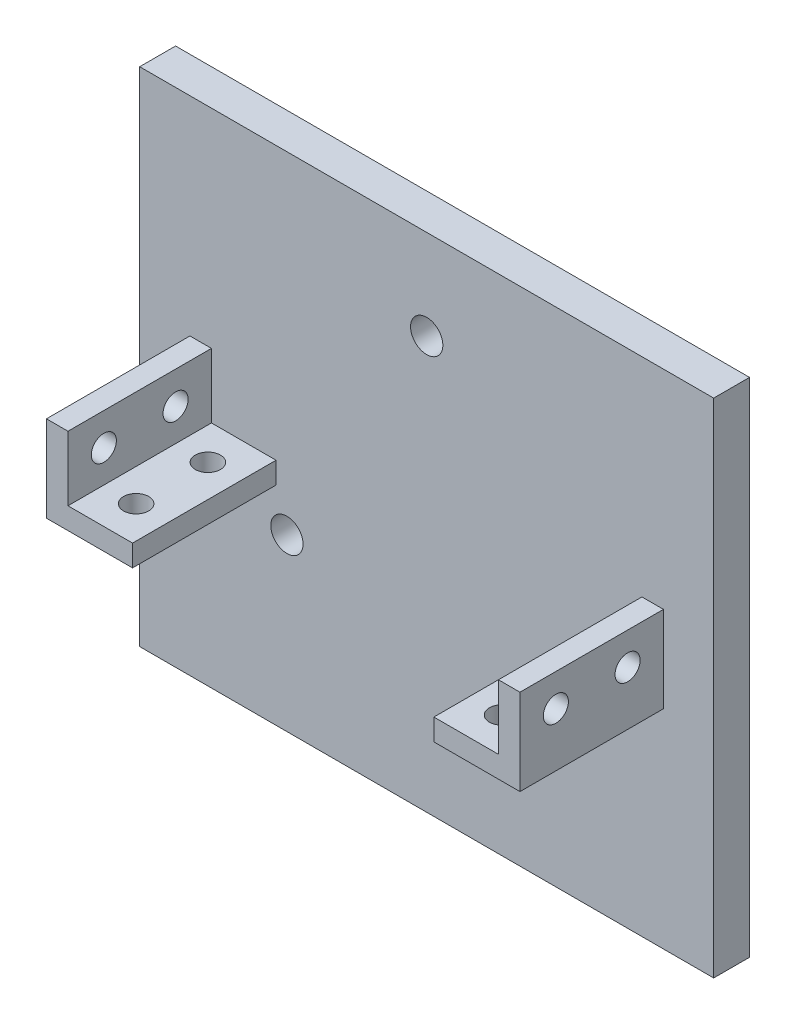
ISO-10303-21;
HEADER;
FILE_DESCRIPTION(('STEP AP214'),'2;1');
FILE_NAME('part.step','',(''),(''),'','','');
FILE_SCHEMA(('AUTOMOTIVE_DESIGN { 1 0 10303 214 1 1 1 1 }'));
ENDSEC;
DATA;
#1=APPLICATION_CONTEXT('core data for automotive mechanical design processes');
#2=APPLICATION_PROTOCOL_DEFINITION('international standard','automotive_design',2000,#1);
#3=PRODUCT_CONTEXT('',#1,'mechanical');
#4=PRODUCT('Part','Part','',(#3));
#5=PRODUCT_RELATED_PRODUCT_CATEGORY('part','',(#4));
#6=PRODUCT_DEFINITION_FORMATION('','',#4);
#7=PRODUCT_DEFINITION_CONTEXT('part definition',#1,'design');
#8=PRODUCT_DEFINITION('design','',#6,#7);
#9=PRODUCT_DEFINITION_SHAPE('','',#8);
#10=(LENGTH_UNIT() NAMED_UNIT(*) SI_UNIT(.MILLI.,.METRE.));
#11=(NAMED_UNIT(*) PLANE_ANGLE_UNIT() SI_UNIT($,.RADIAN.));
#12=(NAMED_UNIT(*) SI_UNIT($,.STERADIAN.) SOLID_ANGLE_UNIT());
#13=UNCERTAINTY_MEASURE_WITH_UNIT(LENGTH_MEASURE(1.E-05),#10,'distance_accuracy_value','');
#14=(GEOMETRIC_REPRESENTATION_CONTEXT(3) GLOBAL_UNCERTAINTY_ASSIGNED_CONTEXT((#13)) GLOBAL_UNIT_ASSIGNED_CONTEXT((#10,
#11,#12)) REPRESENTATION_CONTEXT('',''));
#15=CARTESIAN_POINT('',(0.,0.,0.));
#16=DIRECTION('',(0.,0.,1.));
#17=DIRECTION('',(1.,0.,0.));
#18=AXIS2_PLACEMENT_3D('',#15,#16,#17);
#19=CARTESIAN_POINT('',(0.,0.,5.));
#20=DIRECTION('',(0.,0.,-1.));
#21=DIRECTION('',(-1.,0.,0.));
#22=AXIS2_PLACEMENT_3D('',#19,#20,#21);
#23=PLANE('',#22);
#24=CARTESIAN_POINT('',(0.,22.5,5.));
#25=DIRECTION('',(0.,0.,1.));
#26=DIRECTION('',(1.,0.,0.));
#27=AXIS2_PLACEMENT_3D('',#24,#25,#26);
#28=CIRCLE('',#27,2.25);
#29=CARTESIAN_POINT('',(2.25,22.5,5.));
#30=VERTEX_POINT('',#29);
#31=EDGE_CURVE('E708',#30,#30,#28,.T.);
#32=ORIENTED_EDGE('',*,*,#31,.F.);
#33=EDGE_LOOP('',(#32));
#34=FACE_BOUND('',#33,.T.);
#35=CARTESIAN_POINT('',(19.4855715851508,-11.2499999999994,5.));
#36=DIRECTION('',(0.,0.,1.));
#37=DIRECTION('',(1.,0.,0.));
#38=AXIS2_PLACEMENT_3D('',#35,#36,#37);
#39=CIRCLE('',#38,2.25);
#40=CARTESIAN_POINT('',(21.7355715851508,-11.2499999999994,5.));
#41=VERTEX_POINT('',#40);
#42=EDGE_CURVE('E709',#41,#41,#39,.T.);
#43=ORIENTED_EDGE('',*,*,#42,.F.);
#44=EDGE_LOOP('',(#43));
#45=FACE_BOUND('',#44,.T.);
#46=CARTESIAN_POINT('',(-19.4855715851489,-11.2500000000005,5.));
#47=DIRECTION('',(0.,0.,1.));
#48=DIRECTION('',(1.,0.,0.));
#49=AXIS2_PLACEMENT_3D('',#46,#47,#48);
#50=CIRCLE('',#49,2.25);
#51=CARTESIAN_POINT('',(-17.2355715851489,-11.2500000000005,5.));
#52=VERTEX_POINT('',#51);
#53=EDGE_CURVE('E719',#52,#52,#50,.T.);
#54=ORIENTED_EDGE('',*,*,#53,.F.);
#55=EDGE_LOOP('',(#54));
#56=FACE_BOUND('',#55,.T.);
#57=DIRECTION('',(0.,1.,0.));
#58=VECTOR('',#57,1.);
#59=CARTESIAN_POINT('',(-30.,5.99999999999999,5.));
#60=LINE('',#59,#58);
#61=CARTESIAN_POINT('',(-30.,-3.00000000000001,5.));
#62=VERTEX_POINT('',#61);
#63=CARTESIAN_POINT('',(-30.,5.99999999999999,5.));
#64=VERTEX_POINT('',#63);
#65=EDGE_CURVE('E159',#62,#64,#60,.T.);
#66=ORIENTED_EDGE('',*,*,#65,.F.);
#67=DIRECTION('',(-1.,0.,0.));
#68=VECTOR('',#67,1.);
#69=CARTESIAN_POINT('',(-30.,-3.00000000000001,5.));
#70=LINE('',#69,#68);
#71=CARTESIAN_POINT('',(-21.,-3.00000000000001,5.));
#72=VERTEX_POINT('',#71);
#73=EDGE_CURVE('E201',#72,#62,#70,.T.);
#74=ORIENTED_EDGE('',*,*,#73,.F.);
#75=DIRECTION('',(0.,1.,0.));
#76=VECTOR('',#75,1.);
#77=CARTESIAN_POINT('',(-21.,-3.00000000000001,5.));
#78=LINE('',#77,#76);
#79=CARTESIAN_POINT('',(-21.,-6.00000000000001,5.));
#80=VERTEX_POINT('',#79);
#81=EDGE_CURVE('E223',#80,#72,#78,.T.);
#82=ORIENTED_EDGE('',*,*,#81,.F.);
#83=DIRECTION('',(1.,0.,0.));
#84=VECTOR('',#83,1.);
#85=CARTESIAN_POINT('',(-21.,-6.00000000000001,5.));
#86=LINE('',#85,#84);
#87=CARTESIAN_POINT('',(-33.,-6.00000000000001,5.));
#88=VERTEX_POINT('',#87);
#89=EDGE_CURVE('E220',#88,#80,#86,.T.);
#90=ORIENTED_EDGE('',*,*,#89,.F.);
#91=DIRECTION('',(0.,-1.,0.));
#92=VECTOR('',#91,1.);
#93=CARTESIAN_POINT('',(-33.,-6.00000000000001,5.));
#94=LINE('',#93,#92);
#95=CARTESIAN_POINT('',(-33.,5.99999999999999,5.));
#96=VERTEX_POINT('',#95);
#97=EDGE_CURVE('E217',#96,#88,#94,.T.);
#98=ORIENTED_EDGE('',*,*,#97,.F.);
#99=DIRECTION('',(-1.,0.,0.));
#100=VECTOR('',#99,1.);
#101=CARTESIAN_POINT('',(-33.,5.99999999999999,5.));
#102=LINE('',#101,#100);
#103=EDGE_CURVE('E214',#64,#96,#102,.T.);
#104=ORIENTED_EDGE('',*,*,#103,.F.);
#105=EDGE_LOOP('',(#66,#74,#82,#90,#98,#104));
#106=FACE_BOUND('',#105,.T.);
#107=DIRECTION('',(0.,1.,0.));
#108=VECTOR('',#107,1.);
#109=CARTESIAN_POINT('',(40.,-35.,5.));
#110=LINE('',#109,#108);
#111=CARTESIAN_POINT('',(40.,-35.,5.));
#112=VERTEX_POINT('',#111);
#113=CARTESIAN_POINT('',(40.,35.,5.));
#114=VERTEX_POINT('',#113);
#115=EDGE_CURVE('E246',#112,#114,#110,.T.);
#116=ORIENTED_EDGE('',*,*,#115,.T.);
#117=DIRECTION('',(-1.,0.,0.));
#118=VECTOR('',#117,1.);
#119=CARTESIAN_POINT('',(-40.,35.,5.));
#120=LINE('',#119,#118);
#121=CARTESIAN_POINT('',(-40.,35.,5.));
#122=VERTEX_POINT('',#121);
#123=EDGE_CURVE('E249',#114,#122,#120,.T.);
#124=ORIENTED_EDGE('',*,*,#123,.T.);
#125=DIRECTION('',(0.,-1.,0.));
#126=VECTOR('',#125,1.);
#127=CARTESIAN_POINT('',(-40.,-35.,5.));
#128=LINE('',#127,#126);
#129=CARTESIAN_POINT('',(-40.,-35.,5.));
#130=VERTEX_POINT('',#129);
#131=EDGE_CURVE('E252',#122,#130,#128,.T.);
#132=ORIENTED_EDGE('',*,*,#131,.T.);
#133=DIRECTION('',(1.,0.,0.));
#134=VECTOR('',#133,1.);
#135=CARTESIAN_POINT('',(-40.,-35.,5.));
#136=LINE('',#135,#134);
#137=EDGE_CURVE('E254',#130,#112,#136,.T.);
#138=ORIENTED_EDGE('',*,*,#137,.T.);
#139=EDGE_LOOP('',(#116,#124,#132,#138));
#140=FACE_BOUND('',#139,.T.);
#141=DIRECTION('',(-1.,0.,0.));
#142=VECTOR('',#141,1.);
#143=CARTESIAN_POINT('',(30.,-3.00000000000001,5.));
#144=LINE('',#143,#142);
#145=CARTESIAN_POINT('',(30.,-3.00000000000001,5.));
#146=VERTEX_POINT('',#145);
#147=CARTESIAN_POINT('',(21.,-3.00000000000001,5.));
#148=VERTEX_POINT('',#147);
#149=EDGE_CURVE('E152',#146,#148,#144,.T.);
#150=ORIENTED_EDGE('',*,*,#149,.F.);
#151=DIRECTION('',(0.,-1.,0.));
#152=VECTOR('',#151,1.);
#153=CARTESIAN_POINT('',(30.,5.99999999999999,5.));
#154=LINE('',#153,#152);
#155=CARTESIAN_POINT('',(30.,5.99999999999999,5.));
#156=VERTEX_POINT('',#155);
#157=EDGE_CURVE('E154',#156,#146,#154,.T.);
#158=ORIENTED_EDGE('',*,*,#157,.F.);
#159=DIRECTION('',(-1.,0.,0.));
#160=VECTOR('',#159,1.);
#161=CARTESIAN_POINT('',(33.,5.99999999999999,5.));
#162=LINE('',#161,#160);
#163=CARTESIAN_POINT('',(33.,5.99999999999999,5.));
#164=VERTEX_POINT('',#163);
#165=EDGE_CURVE('E170',#164,#156,#162,.T.);
#166=ORIENTED_EDGE('',*,*,#165,.F.);
#167=DIRECTION('',(0.,1.,0.));
#168=VECTOR('',#167,1.);
#169=CARTESIAN_POINT('',(33.,-6.00000000000001,5.));
#170=LINE('',#169,#168);
#171=CARTESIAN_POINT('',(33.,-6.00000000000001,5.));
#172=VERTEX_POINT('',#171);
#173=EDGE_CURVE('E184',#172,#164,#170,.T.);
#174=ORIENTED_EDGE('',*,*,#173,.F.);
#175=DIRECTION('',(1.,0.,0.));
#176=VECTOR('',#175,1.);
#177=CARTESIAN_POINT('',(21.,-6.00000000000001,5.));
#178=LINE('',#177,#176);
#179=CARTESIAN_POINT('',(21.,-6.00000000000001,5.));
#180=VERTEX_POINT('',#179);
#181=EDGE_CURVE('E63',#180,#172,#178,.T.);
#182=ORIENTED_EDGE('',*,*,#181,.F.);
#183=DIRECTION('',(0.,-1.,0.));
#184=VECTOR('',#183,1.);
#185=CARTESIAN_POINT('',(21.,-3.00000000000001,5.));
#186=LINE('',#185,#184);
#187=EDGE_CURVE('E58',#148,#180,#186,.T.);
#188=ORIENTED_EDGE('',*,*,#187,.F.);
#189=EDGE_LOOP('',(#150,#158,#166,#174,#182,#188));
#190=FACE_BOUND('',#189,.T.);
#191=ADVANCED_FACE('F41',(#34,#45,#56,#106,#140,#190),#23,.F.);
#192=CARTESIAN_POINT('',(40.,-35.,5.));
#193=DIRECTION('',(-1.,0.,0.));
#194=DIRECTION('',(0.,0.,1.));
#195=AXIS2_PLACEMENT_3D('',#192,#193,#194);
#196=PLANE('',#195);
#197=DIRECTION('',(0.,1.,0.));
#198=VECTOR('',#197,1.);
#199=CARTESIAN_POINT('',(40.,-35.,0.));
#200=LINE('',#199,#198);
#201=CARTESIAN_POINT('',(40.,-35.,0.));
#202=VERTEX_POINT('',#201);
#203=CARTESIAN_POINT('',(40.,35.,0.));
#204=VERTEX_POINT('',#203);
#205=EDGE_CURVE('E245',#202,#204,#200,.T.);
#206=ORIENTED_EDGE('',*,*,#205,.T.);
#207=DIRECTION('',(0.,0.,-1.));
#208=VECTOR('',#207,1.);
#209=CARTESIAN_POINT('',(40.,35.,5.));
#210=LINE('',#209,#208);
#211=EDGE_CURVE('E11',#114,#204,#210,.T.);
#212=ORIENTED_EDGE('',*,*,#211,.F.);
#213=ORIENTED_EDGE('',*,*,#115,.F.);
#214=DIRECTION('',(0.,0.,-1.));
#215=VECTOR('',#214,1.);
#216=CARTESIAN_POINT('',(40.,-35.,5.));
#217=LINE('',#216,#215);
#218=EDGE_CURVE('E256',#112,#202,#217,.T.);
#219=ORIENTED_EDGE('',*,*,#218,.T.);
#220=EDGE_LOOP('',(#206,#212,#213,#219));
#221=FACE_BOUND('',#220,.T.);
#222=ADVANCED_FACE('F43',(#221),#196,.F.);
#223=CARTESIAN_POINT('',(-40.,35.,5.));
#224=DIRECTION('',(0.,-1.,0.));
#225=DIRECTION('',(0.,0.,-1.));
#226=AXIS2_PLACEMENT_3D('',#223,#224,#225);
#227=PLANE('',#226);
#228=DIRECTION('',(-1.,0.,0.));
#229=VECTOR('',#228,1.);
#230=CARTESIAN_POINT('',(-40.,35.,0.));
#231=LINE('',#230,#229);
#232=CARTESIAN_POINT('',(-40.,35.,0.));
#233=VERTEX_POINT('',#232);
#234=EDGE_CURVE('E259',#204,#233,#231,.T.);
#235=ORIENTED_EDGE('',*,*,#234,.T.);
#236=DIRECTION('',(0.,0.,-1.));
#237=VECTOR('',#236,1.);
#238=CARTESIAN_POINT('',(-40.,35.,5.));
#239=LINE('',#238,#237);
#240=EDGE_CURVE('E50',#122,#233,#239,.T.);
#241=ORIENTED_EDGE('',*,*,#240,.F.);
#242=ORIENTED_EDGE('',*,*,#123,.F.);
#243=ORIENTED_EDGE('',*,*,#211,.T.);
#244=EDGE_LOOP('',(#235,#241,#242,#243));
#245=FACE_BOUND('',#244,.T.);
#246=ADVANCED_FACE('F354',(#245),#227,.F.);
#247=CARTESIAN_POINT('',(-40.,-35.,5.));
#248=DIRECTION('',(1.,0.,0.));
#249=DIRECTION('',(0.,0.,-1.));
#250=AXIS2_PLACEMENT_3D('',#247,#248,#249);
#251=PLANE('',#250);
#252=DIRECTION('',(0.,-1.,0.));
#253=VECTOR('',#252,1.);
#254=CARTESIAN_POINT('',(-40.,-35.,0.));
#255=LINE('',#254,#253);
#256=CARTESIAN_POINT('',(-40.,-35.,0.));
#257=VERTEX_POINT('',#256);
#258=EDGE_CURVE('E261',#233,#257,#255,.T.);
#259=ORIENTED_EDGE('',*,*,#258,.T.);
#260=DIRECTION('',(0.,0.,-1.));
#261=VECTOR('',#260,1.);
#262=CARTESIAN_POINT('',(-40.,-35.,5.));
#263=LINE('',#262,#261);
#264=EDGE_CURVE('E266',#130,#257,#263,.T.);
#265=ORIENTED_EDGE('',*,*,#264,.F.);
#266=ORIENTED_EDGE('',*,*,#131,.F.);
#267=ORIENTED_EDGE('',*,*,#240,.T.);
#268=EDGE_LOOP('',(#259,#265,#266,#267));
#269=FACE_BOUND('',#268,.T.);
#270=ADVANCED_FACE('F369',(#269),#251,.F.);
#271=CARTESIAN_POINT('',(-40.,-35.,5.));
#272=DIRECTION('',(0.,1.,0.));
#273=DIRECTION('',(0.,0.,1.));
#274=AXIS2_PLACEMENT_3D('',#271,#272,#273);
#275=PLANE('',#274);
#276=DIRECTION('',(1.,0.,0.));
#277=VECTOR('',#276,1.);
#278=CARTESIAN_POINT('',(-40.,-35.,0.));
#279=LINE('',#278,#277);
#280=EDGE_CURVE('E250',#257,#202,#279,.T.);
#281=ORIENTED_EDGE('',*,*,#280,.T.);
#282=ORIENTED_EDGE('',*,*,#218,.F.);
#283=ORIENTED_EDGE('',*,*,#137,.F.);
#284=ORIENTED_EDGE('',*,*,#264,.T.);
#285=EDGE_LOOP('',(#281,#282,#283,#284));
#286=FACE_BOUND('',#285,.T.);
#287=ADVANCED_FACE('F365',(#286),#275,.F.);
#288=CARTESIAN_POINT('',(0.,0.,0.));
#289=DIRECTION('',(0.,0.,-1.));
#290=DIRECTION('',(-1.,0.,0.));
#291=AXIS2_PLACEMENT_3D('',#288,#289,#290);
#292=PLANE('',#291);
#293=CARTESIAN_POINT('',(0.,22.5,0.));
#294=DIRECTION('',(0.,0.,1.));
#295=DIRECTION('',(1.,0.,0.));
#296=AXIS2_PLACEMENT_3D('',#293,#294,#295);
#297=CIRCLE('',#296,2.25);
#298=CARTESIAN_POINT('',(2.25,22.5,0.));
#299=VERTEX_POINT('',#298);
#300=EDGE_CURVE('E706',#299,#299,#297,.T.);
#301=ORIENTED_EDGE('',*,*,#300,.T.);
#302=EDGE_LOOP('',(#301));
#303=FACE_BOUND('',#302,.T.);
#304=CARTESIAN_POINT('',(19.4855715851508,-11.2499999999994,0.));
#305=DIRECTION('',(0.,0.,1.));
#306=DIRECTION('',(1.,0.,0.));
#307=AXIS2_PLACEMENT_3D('',#304,#305,#306);
#308=CIRCLE('',#307,2.25);
#309=CARTESIAN_POINT('',(21.7355715851508,-11.2499999999994,0.));
#310=VERTEX_POINT('',#309);
#311=EDGE_CURVE('E714',#310,#310,#308,.T.);
#312=ORIENTED_EDGE('',*,*,#311,.T.);
#313=EDGE_LOOP('',(#312));
#314=FACE_BOUND('',#313,.T.);
#315=CARTESIAN_POINT('',(-19.4855715851489,-11.2500000000005,0.));
#316=DIRECTION('',(0.,0.,1.));
#317=DIRECTION('',(1.,0.,0.));
#318=AXIS2_PLACEMENT_3D('',#315,#316,#317);
#319=CIRCLE('',#318,2.25);
#320=CARTESIAN_POINT('',(-17.2355715851489,-11.2500000000005,0.));
#321=VERTEX_POINT('',#320);
#322=EDGE_CURVE('E722',#321,#321,#319,.T.);
#323=ORIENTED_EDGE('',*,*,#322,.T.);
#324=EDGE_LOOP('',(#323));
#325=FACE_BOUND('',#324,.T.);
#326=ORIENTED_EDGE('',*,*,#205,.F.);
#327=ORIENTED_EDGE('',*,*,#280,.F.);
#328=ORIENTED_EDGE('',*,*,#258,.F.);
#329=ORIENTED_EDGE('',*,*,#234,.F.);
#330=EDGE_LOOP('',(#326,#327,#328,#329));
#331=FACE_BOUND('',#330,.T.);
#332=ADVANCED_FACE('F362',(#303,#314,#325,#331),#292,.T.);
#333=CARTESIAN_POINT('',(-30.,5.99999999999999,25.));
#334=DIRECTION('',(-1.,0.,0.));
#335=DIRECTION('',(0.,-1.,0.));
#336=AXIS2_PLACEMENT_3D('',#333,#334,#335);
#337=PLANE('',#336);
#338=CARTESIAN_POINT('',(-30.,1.50000000000003,10.));
#339=DIRECTION('',(-1.,0.,0.));
#340=DIRECTION('',(0.,-1.,0.));
#341=AXIS2_PLACEMENT_3D('',#338,#339,#340);
#342=CIRCLE('',#341,1.75);
#343=CARTESIAN_POINT('',(-30.,-0.249999999999974,10.));
#344=VERTEX_POINT('',#343);
#345=EDGE_CURVE('E307',#344,#344,#342,.T.);
#346=ORIENTED_EDGE('',*,*,#345,.T.);
#347=EDGE_LOOP('',(#346));
#348=FACE_BOUND('',#347,.T.);
#349=CARTESIAN_POINT('',(-30.,1.50000000000002,20.));
#350=DIRECTION('',(-1.,0.,0.));
#351=DIRECTION('',(0.,-1.,0.));
#352=AXIS2_PLACEMENT_3D('',#349,#350,#351);
#353=CIRCLE('',#352,1.75);
#354=CARTESIAN_POINT('',(-30.,-0.249999999999975,20.));
#355=VERTEX_POINT('',#354);
#356=EDGE_CURVE('E279',#355,#355,#353,.T.);
#357=ORIENTED_EDGE('',*,*,#356,.T.);
#358=EDGE_LOOP('',(#357));
#359=FACE_BOUND('',#358,.T.);
#360=ORIENTED_EDGE('',*,*,#65,.T.);
#361=DIRECTION('',(0.,0.,-1.));
#362=VECTOR('',#361,1.);
#363=CARTESIAN_POINT('',(-30.,5.99999999999999,25.));
#364=LINE('',#363,#362);
#365=CARTESIAN_POINT('',(-30.,5.99999999999999,25.));
#366=VERTEX_POINT('',#365);
#367=EDGE_CURVE('E242',#366,#64,#364,.T.);
#368=ORIENTED_EDGE('',*,*,#367,.F.);
#369=DIRECTION('',(0.,1.,0.));
#370=VECTOR('',#369,1.);
#371=CARTESIAN_POINT('',(-30.,5.99999999999999,25.));
#372=LINE('',#371,#370);
#373=CARTESIAN_POINT('',(-30.,-3.00000000000001,25.));
#374=VERTEX_POINT('',#373);
#375=EDGE_CURVE('E197',#374,#366,#372,.T.);
#376=ORIENTED_EDGE('',*,*,#375,.F.);
#377=DIRECTION('',(0.,0.,-1.));
#378=VECTOR('',#377,1.);
#379=CARTESIAN_POINT('',(-30.,-3.00000000000001,25.));
#380=LINE('',#379,#378);
#381=EDGE_CURVE('E211',#374,#62,#380,.T.);
#382=ORIENTED_EDGE('',*,*,#381,.T.);
#383=EDGE_LOOP('',(#360,#368,#376,#382));
#384=FACE_BOUND('',#383,.T.);
#385=ADVANCED_FACE('F360',(#348,#359,#384),#337,.F.);
#386=CARTESIAN_POINT('',(-33.,5.99999999999999,25.));
#387=DIRECTION('',(0.,-1.,0.));
#388=DIRECTION('',(1.,0.,0.));
#389=AXIS2_PLACEMENT_3D('',#386,#387,#388);
#390=PLANE('',#389);
#391=ORIENTED_EDGE('',*,*,#103,.T.);
#392=DIRECTION('',(0.,0.,-1.));
#393=VECTOR('',#392,1.);
#394=CARTESIAN_POINT('',(-33.,5.99999999999999,25.));
#395=LINE('',#394,#393);
#396=CARTESIAN_POINT('',(-33.,5.99999999999999,25.));
#397=VERTEX_POINT('',#396);
#398=EDGE_CURVE('E239',#397,#96,#395,.T.);
#399=ORIENTED_EDGE('',*,*,#398,.F.);
#400=DIRECTION('',(-1.,0.,0.));
#401=VECTOR('',#400,1.);
#402=CARTESIAN_POINT('',(-33.,5.99999999999999,25.));
#403=LINE('',#402,#401);
#404=EDGE_CURVE('E200',#366,#397,#403,.T.);
#405=ORIENTED_EDGE('',*,*,#404,.F.);
#406=ORIENTED_EDGE('',*,*,#367,.T.);
#407=EDGE_LOOP('',(#391,#399,#405,#406));
#408=FACE_BOUND('',#407,.T.);
#409=ADVANCED_FACE('F411',(#408),#390,.F.);
#410=CARTESIAN_POINT('',(-33.,-6.00000000000001,25.));
#411=DIRECTION('',(1.,0.,0.));
#412=DIRECTION('',(0.,0.,-1.));
#413=AXIS2_PLACEMENT_3D('',#410,#411,#412);
#414=PLANE('',#413);
#415=CARTESIAN_POINT('',(-33.,1.50000000000003,10.));
#416=DIRECTION('',(1.,0.,0.));
#417=DIRECTION('',(0.,0.,-1.));
#418=AXIS2_PLACEMENT_3D('',#415,#416,#417);
#419=CIRCLE('',#418,1.75);
#420=CARTESIAN_POINT('',(-33.,1.50000000000003,8.25));
#421=VERTEX_POINT('',#420);
#422=EDGE_CURVE('E278',#421,#421,#419,.T.);
#423=ORIENTED_EDGE('',*,*,#422,.T.);
#424=EDGE_LOOP('',(#423));
#425=FACE_BOUND('',#424,.T.);
#426=CARTESIAN_POINT('',(-33.,1.50000000000003,20.));
#427=DIRECTION('',(1.,0.,0.));
#428=DIRECTION('',(0.,0.,-1.));
#429=AXIS2_PLACEMENT_3D('',#426,#427,#428);
#430=CIRCLE('',#429,1.75);
#431=CARTESIAN_POINT('',(-33.,1.50000000000003,18.25));
#432=VERTEX_POINT('',#431);
#433=EDGE_CURVE('E274',#432,#432,#430,.T.);
#434=ORIENTED_EDGE('',*,*,#433,.T.);
#435=EDGE_LOOP('',(#434));
#436=FACE_BOUND('',#435,.T.);
#437=ORIENTED_EDGE('',*,*,#97,.T.);
#438=DIRECTION('',(0.,0.,-1.));
#439=VECTOR('',#438,1.);
#440=CARTESIAN_POINT('',(-33.,-6.00000000000001,25.));
#441=LINE('',#440,#439);
#442=CARTESIAN_POINT('',(-33.,-6.00000000000001,25.));
#443=VERTEX_POINT('',#442);
#444=EDGE_CURVE('E236',#443,#88,#441,.T.);
#445=ORIENTED_EDGE('',*,*,#444,.F.);
#446=DIRECTION('',(0.,-1.,0.));
#447=VECTOR('',#446,1.);
#448=CARTESIAN_POINT('',(-33.,-6.00000000000001,25.));
#449=LINE('',#448,#447);
#450=EDGE_CURVE('E203',#397,#443,#449,.T.);
#451=ORIENTED_EDGE('',*,*,#450,.F.);
#452=ORIENTED_EDGE('',*,*,#398,.T.);
#453=EDGE_LOOP('',(#437,#445,#451,#452));
#454=FACE_BOUND('',#453,.T.);
#455=ADVANCED_FACE('F418',(#425,#436,#454),#414,.F.);
#456=CARTESIAN_POINT('',(-21.,-6.00000000000001,25.));
#457=DIRECTION('',(0.,1.,0.));
#458=DIRECTION('',(-1.,0.,0.));
#459=AXIS2_PLACEMENT_3D('',#456,#457,#458);
#460=PLANE('',#459);
#461=CARTESIAN_POINT('',(-25.5,-6.00000000000001,10.));
#462=DIRECTION('',(0.,-1.,0.));
#463=DIRECTION('',(1.,0.,0.));
#464=AXIS2_PLACEMENT_3D('',#461,#462,#463);
#465=CIRCLE('',#464,1.75);
#466=CARTESIAN_POINT('',(-23.75,-6.00000000000001,10.));
#467=VERTEX_POINT('',#466);
#468=EDGE_CURVE('E727',#467,#467,#465,.T.);
#469=ORIENTED_EDGE('',*,*,#468,.F.);
#470=EDGE_LOOP('',(#469));
#471=FACE_BOUND('',#470,.T.);
#472=CARTESIAN_POINT('',(-25.5,-6.00000000000001,20.));
#473=DIRECTION('',(0.,-1.,0.));
#474=DIRECTION('',(1.,0.,0.));
#475=AXIS2_PLACEMENT_3D('',#472,#473,#474);
#476=CIRCLE('',#475,1.75);
#477=CARTESIAN_POINT('',(-23.75,-6.00000000000001,20.));
#478=VERTEX_POINT('',#477);
#479=EDGE_CURVE('E711',#478,#478,#476,.T.);
#480=ORIENTED_EDGE('',*,*,#479,.F.);
#481=EDGE_LOOP('',(#480));
#482=FACE_BOUND('',#481,.T.);
#483=ORIENTED_EDGE('',*,*,#89,.T.);
#484=DIRECTION('',(0.,0.,-1.));
#485=VECTOR('',#484,1.);
#486=CARTESIAN_POINT('',(-21.,-6.00000000000001,25.));
#487=LINE('',#486,#485);
#488=CARTESIAN_POINT('',(-21.,-6.00000000000001,25.));
#489=VERTEX_POINT('',#488);
#490=EDGE_CURVE('E233',#489,#80,#487,.T.);
#491=ORIENTED_EDGE('',*,*,#490,.F.);
#492=DIRECTION('',(1.,0.,0.));
#493=VECTOR('',#492,1.);
#494=CARTESIAN_POINT('',(-21.,-6.00000000000001,25.));
#495=LINE('',#494,#493);
#496=EDGE_CURVE('E205',#443,#489,#495,.T.);
#497=ORIENTED_EDGE('',*,*,#496,.F.);
#498=ORIENTED_EDGE('',*,*,#444,.T.);
#499=EDGE_LOOP('',(#483,#491,#497,#498));
#500=FACE_BOUND('',#499,.T.);
#501=ADVANCED_FACE('F425',(#471,#482,#500),#460,.F.);
#502=CARTESIAN_POINT('',(-21.,-3.00000000000001,25.));
#503=DIRECTION('',(-1.,0.,0.));
#504=DIRECTION('',(0.,-1.,0.));
#505=AXIS2_PLACEMENT_3D('',#502,#503,#504);
#506=PLANE('',#505);
#507=ORIENTED_EDGE('',*,*,#81,.T.);
#508=DIRECTION('',(0.,0.,-1.));
#509=VECTOR('',#508,1.);
#510=CARTESIAN_POINT('',(-21.,-3.00000000000001,25.));
#511=LINE('',#510,#509);
#512=CARTESIAN_POINT('',(-21.,-3.00000000000001,25.));
#513=VERTEX_POINT('',#512);
#514=EDGE_CURVE('E230',#513,#72,#511,.T.);
#515=ORIENTED_EDGE('',*,*,#514,.F.);
#516=DIRECTION('',(0.,1.,0.));
#517=VECTOR('',#516,1.);
#518=CARTESIAN_POINT('',(-21.,-3.00000000000001,25.));
#519=LINE('',#518,#517);
#520=EDGE_CURVE('E207',#489,#513,#519,.T.);
#521=ORIENTED_EDGE('',*,*,#520,.F.);
#522=ORIENTED_EDGE('',*,*,#490,.T.);
#523=EDGE_LOOP('',(#507,#515,#521,#522));
#524=FACE_BOUND('',#523,.T.);
#525=ADVANCED_FACE('F434',(#524),#506,.F.);
#526=CARTESIAN_POINT('',(-30.,-3.00000000000001,25.));
#527=DIRECTION('',(0.,-1.,0.));
#528=DIRECTION('',(0.,0.,-1.));
#529=AXIS2_PLACEMENT_3D('',#526,#527,#528);
#530=PLANE('',#529);
#531=CARTESIAN_POINT('',(-25.5,-3.00000000000001,10.));
#532=DIRECTION('',(0.,-1.,0.));
#533=DIRECTION('',(0.,0.,-1.));
#534=AXIS2_PLACEMENT_3D('',#531,#532,#533);
#535=CIRCLE('',#534,1.75);
#536=CARTESIAN_POINT('',(-25.5,-3.00000000000001,8.25));
#537=VERTEX_POINT('',#536);
#538=EDGE_CURVE('E45',#537,#537,#535,.T.);
#539=ORIENTED_EDGE('',*,*,#538,.T.);
#540=EDGE_LOOP('',(#539));
#541=FACE_BOUND('',#540,.T.);
#542=CARTESIAN_POINT('',(-25.5,-3.00000000000001,20.));
#543=DIRECTION('',(0.,-1.,0.));
#544=DIRECTION('',(0.,0.,-1.));
#545=AXIS2_PLACEMENT_3D('',#542,#543,#544);
#546=CIRCLE('',#545,1.75);
#547=CARTESIAN_POINT('',(-25.5,-3.00000000000001,18.25));
#548=VERTEX_POINT('',#547);
#549=EDGE_CURVE('E280',#548,#548,#546,.T.);
#550=ORIENTED_EDGE('',*,*,#549,.T.);
#551=EDGE_LOOP('',(#550));
#552=FACE_BOUND('',#551,.T.);
#553=ORIENTED_EDGE('',*,*,#73,.T.);
#554=ORIENTED_EDGE('',*,*,#381,.F.);
#555=DIRECTION('',(-1.,0.,0.));
#556=VECTOR('',#555,1.);
#557=CARTESIAN_POINT('',(-30.,-3.00000000000001,25.));
#558=LINE('',#557,#556);
#559=EDGE_CURVE('E209',#513,#374,#558,.T.);
#560=ORIENTED_EDGE('',*,*,#559,.F.);
#561=ORIENTED_EDGE('',*,*,#514,.T.);
#562=EDGE_LOOP('',(#553,#554,#560,#561));
#563=FACE_BOUND('',#562,.T.);
#564=ADVANCED_FACE('F443',(#541,#552,#563),#530,.F.);
#565=CARTESIAN_POINT('',(0.,0.,25.));
#566=DIRECTION('',(0.,0.,1.));
#567=DIRECTION('',(1.,0.,0.));
#568=AXIS2_PLACEMENT_3D('',#565,#566,#567);
#569=PLANE('',#568);
#570=ORIENTED_EDGE('',*,*,#375,.T.);
#571=ORIENTED_EDGE('',*,*,#404,.T.);
#572=ORIENTED_EDGE('',*,*,#450,.T.);
#573=ORIENTED_EDGE('',*,*,#496,.T.);
#574=ORIENTED_EDGE('',*,*,#520,.T.);
#575=ORIENTED_EDGE('',*,*,#559,.T.);
#576=EDGE_LOOP('',(#570,#571,#572,#573,#574,#575));
#577=FACE_BOUND('',#576,.T.);
#578=ADVANCED_FACE('F451',(#577),#569,.T.);
#579=CARTESIAN_POINT('',(30.,-3.00000000000001,25.));
#580=DIRECTION('',(0.,-1.,0.));
#581=DIRECTION('',(0.,0.,-1.));
#582=AXIS2_PLACEMENT_3D('',#579,#580,#581);
#583=PLANE('',#582);
#584=CARTESIAN_POINT('',(25.5,-3.00000000000001,20.));
#585=DIRECTION('',(0.,-1.,0.));
#586=DIRECTION('',(0.,0.,-1.));
#587=AXIS2_PLACEMENT_3D('',#584,#585,#586);
#588=CIRCLE('',#587,1.75);
#589=CARTESIAN_POINT('',(25.5,-3.00000000000001,18.25));
#590=VERTEX_POINT('',#589);
#591=EDGE_CURVE('E282',#590,#590,#588,.T.);
#592=ORIENTED_EDGE('',*,*,#591,.T.);
#593=EDGE_LOOP('',(#592));
#594=FACE_BOUND('',#593,.T.);
#595=CARTESIAN_POINT('',(25.5,-3.00000000000001,10.));
#596=DIRECTION('',(0.,-1.,0.));
#597=DIRECTION('',(0.,0.,-1.));
#598=AXIS2_PLACEMENT_3D('',#595,#596,#597);
#599=CIRCLE('',#598,1.75);
#600=CARTESIAN_POINT('',(25.5,-3.00000000000001,8.25));
#601=VERTEX_POINT('',#600);
#602=EDGE_CURVE('E288',#601,#601,#599,.T.);
#603=ORIENTED_EDGE('',*,*,#602,.T.);
#604=EDGE_LOOP('',(#603));
#605=FACE_BOUND('',#604,.T.);
#606=ORIENTED_EDGE('',*,*,#149,.T.);
#607=DIRECTION('',(0.,0.,-1.));
#608=VECTOR('',#607,1.);
#609=CARTESIAN_POINT('',(21.,-3.00000000000001,25.));
#610=LINE('',#609,#608);
#611=CARTESIAN_POINT('',(21.,-3.00000000000001,25.));
#612=VERTEX_POINT('',#611);
#613=EDGE_CURVE('E310',#612,#148,#610,.T.);
#614=ORIENTED_EDGE('',*,*,#613,.F.);
#615=DIRECTION('',(-1.,0.,0.));
#616=VECTOR('',#615,1.);
#617=CARTESIAN_POINT('',(30.,-3.00000000000001,25.));
#618=LINE('',#617,#616);
#619=CARTESIAN_POINT('',(30.,-3.00000000000001,25.));
#620=VERTEX_POINT('',#619);
#621=EDGE_CURVE('E171',#620,#612,#618,.T.);
#622=ORIENTED_EDGE('',*,*,#621,.F.);
#623=DIRECTION('',(0.,0.,-1.));
#624=VECTOR('',#623,1.);
#625=CARTESIAN_POINT('',(30.,-3.00000000000001,25.));
#626=LINE('',#625,#624);
#627=EDGE_CURVE('E166',#620,#146,#626,.T.);
#628=ORIENTED_EDGE('',*,*,#627,.T.);
#629=EDGE_LOOP('',(#606,#614,#622,#628));
#630=FACE_BOUND('',#629,.T.);
#631=ADVANCED_FACE('F173',(#594,#605,#630),#583,.F.);
#632=CARTESIAN_POINT('',(21.,-3.00000000000001,25.));
#633=DIRECTION('',(1.,0.,0.));
#634=DIRECTION('',(0.,1.,0.));
#635=AXIS2_PLACEMENT_3D('',#632,#633,#634);
#636=PLANE('',#635);
#637=ORIENTED_EDGE('',*,*,#187,.T.);
#638=DIRECTION('',(0.,0.,-1.));
#639=VECTOR('',#638,1.);
#640=CARTESIAN_POINT('',(21.,-6.00000000000001,25.));
#641=LINE('',#640,#639);
#642=CARTESIAN_POINT('',(21.,-6.00000000000001,25.));
#643=VERTEX_POINT('',#642);
#644=EDGE_CURVE('E312',#643,#180,#641,.T.);
#645=ORIENTED_EDGE('',*,*,#644,.F.);
#646=DIRECTION('',(0.,-1.,0.));
#647=VECTOR('',#646,1.);
#648=CARTESIAN_POINT('',(21.,-3.00000000000001,25.));
#649=LINE('',#648,#647);
#650=EDGE_CURVE('E194',#612,#643,#649,.T.);
#651=ORIENTED_EDGE('',*,*,#650,.F.);
#652=ORIENTED_EDGE('',*,*,#613,.T.);
#653=EDGE_LOOP('',(#637,#645,#651,#652));
#654=FACE_BOUND('',#653,.T.);
#655=ADVANCED_FACE('F331',(#654),#636,.F.);
#656=CARTESIAN_POINT('',(21.,-6.00000000000001,25.));
#657=DIRECTION('',(0.,1.,0.));
#658=DIRECTION('',(-1.,0.,0.));
#659=AXIS2_PLACEMENT_3D('',#656,#657,#658);
#660=PLANE('',#659);
#661=CARTESIAN_POINT('',(25.5,-6.,20.));
#662=DIRECTION('',(0.,-1.,0.));
#663=DIRECTION('',(1.,0.,0.));
#664=AXIS2_PLACEMENT_3D('',#661,#662,#663);
#665=CIRCLE('',#664,1.75);
#666=CARTESIAN_POINT('',(27.25,-6.,20.));
#667=VERTEX_POINT('',#666);
#668=EDGE_CURVE('E728',#667,#667,#665,.T.);
#669=ORIENTED_EDGE('',*,*,#668,.F.);
#670=EDGE_LOOP('',(#669));
#671=FACE_BOUND('',#670,.T.);
#672=CARTESIAN_POINT('',(25.5,-6.,10.));
#673=DIRECTION('',(0.,-1.,0.));
#674=DIRECTION('',(1.,0.,0.));
#675=AXIS2_PLACEMENT_3D('',#672,#673,#674);
#676=CIRCLE('',#675,1.75);
#677=CARTESIAN_POINT('',(27.25,-6.,10.));
#678=VERTEX_POINT('',#677);
#679=EDGE_CURVE('E293',#678,#678,#676,.T.);
#680=ORIENTED_EDGE('',*,*,#679,.F.);
#681=EDGE_LOOP('',(#680));
#682=FACE_BOUND('',#681,.T.);
#683=ORIENTED_EDGE('',*,*,#181,.T.);
#684=DIRECTION('',(0.,0.,-1.));
#685=VECTOR('',#684,1.);
#686=CARTESIAN_POINT('',(33.,-6.00000000000001,25.));
#687=LINE('',#686,#685);
#688=CARTESIAN_POINT('',(33.,-6.00000000000001,25.));
#689=VERTEX_POINT('',#688);
#690=EDGE_CURVE('E315',#689,#172,#687,.T.);
#691=ORIENTED_EDGE('',*,*,#690,.F.);
#692=DIRECTION('',(1.,0.,0.));
#693=VECTOR('',#692,1.);
#694=CARTESIAN_POINT('',(21.,-6.00000000000001,25.));
#695=LINE('',#694,#693);
#696=EDGE_CURVE('E192',#643,#689,#695,.T.);
#697=ORIENTED_EDGE('',*,*,#696,.F.);
#698=ORIENTED_EDGE('',*,*,#644,.T.);
#699=EDGE_LOOP('',(#683,#691,#697,#698));
#700=FACE_BOUND('',#699,.T.);
#701=ADVANCED_FACE('F327',(#671,#682,#700),#660,.F.);
#702=CARTESIAN_POINT('',(33.,-6.00000000000001,25.));
#703=DIRECTION('',(-1.,0.,0.));
#704=DIRECTION('',(0.,0.,1.));
#705=AXIS2_PLACEMENT_3D('',#702,#703,#704);
#706=PLANE('',#705);
#707=CARTESIAN_POINT('',(33.,1.49999999999999,10.));
#708=DIRECTION('',(1.,0.,0.));
#709=DIRECTION('',(0.,1.,0.));
#710=AXIS2_PLACEMENT_3D('',#707,#708,#709);
#711=CIRCLE('',#710,1.75);
#712=CARTESIAN_POINT('',(33.,3.24999999999999,10.));
#713=VERTEX_POINT('',#712);
#714=EDGE_CURVE('E275',#713,#713,#711,.T.);
#715=ORIENTED_EDGE('',*,*,#714,.F.);
#716=EDGE_LOOP('',(#715));
#717=FACE_BOUND('',#716,.T.);
#718=CARTESIAN_POINT('',(33.,1.49999999999999,20.));
#719=DIRECTION('',(1.,0.,0.));
#720=DIRECTION('',(0.,1.,0.));
#721=AXIS2_PLACEMENT_3D('',#718,#719,#720);
#722=CIRCLE('',#721,1.75);
#723=CARTESIAN_POINT('',(33.,3.24999999999999,20.));
#724=VERTEX_POINT('',#723);
#725=EDGE_CURVE('E286',#724,#724,#722,.T.);
#726=ORIENTED_EDGE('',*,*,#725,.F.);
#727=EDGE_LOOP('',(#726));
#728=FACE_BOUND('',#727,.T.);
#729=ORIENTED_EDGE('',*,*,#173,.T.);
#730=DIRECTION('',(0.,0.,-1.));
#731=VECTOR('',#730,1.);
#732=CARTESIAN_POINT('',(33.,5.99999999999999,25.));
#733=LINE('',#732,#731);
#734=CARTESIAN_POINT('',(33.,5.99999999999999,25.));
#735=VERTEX_POINT('',#734);
#736=EDGE_CURVE('E179',#735,#164,#733,.T.);
#737=ORIENTED_EDGE('',*,*,#736,.F.);
#738=DIRECTION('',(0.,1.,0.));
#739=VECTOR('',#738,1.);
#740=CARTESIAN_POINT('',(33.,-6.00000000000001,25.));
#741=LINE('',#740,#739);
#742=EDGE_CURVE('E190',#689,#735,#741,.T.);
#743=ORIENTED_EDGE('',*,*,#742,.F.);
#744=ORIENTED_EDGE('',*,*,#690,.T.);
#745=EDGE_LOOP('',(#729,#737,#743,#744));
#746=FACE_BOUND('',#745,.T.);
#747=ADVANCED_FACE('F324',(#717,#728,#746),#706,.F.);
#748=CARTESIAN_POINT('',(33.,5.99999999999999,25.));
#749=DIRECTION('',(0.,-1.,0.));
#750=DIRECTION('',(1.,0.,0.));
#751=AXIS2_PLACEMENT_3D('',#748,#749,#750);
#752=PLANE('',#751);
#753=ORIENTED_EDGE('',*,*,#165,.T.);
#754=DIRECTION('',(0.,0.,-1.));
#755=VECTOR('',#754,1.);
#756=CARTESIAN_POINT('',(30.,5.99999999999999,25.));
#757=LINE('',#756,#755);
#758=CARTESIAN_POINT('',(30.,5.99999999999999,25.));
#759=VERTEX_POINT('',#758);
#760=EDGE_CURVE('E169',#759,#156,#757,.T.);
#761=ORIENTED_EDGE('',*,*,#760,.F.);
#762=DIRECTION('',(-1.,0.,0.));
#763=VECTOR('',#762,1.);
#764=CARTESIAN_POINT('',(33.,5.99999999999999,25.));
#765=LINE('',#764,#763);
#766=EDGE_CURVE('E177',#735,#759,#765,.T.);
#767=ORIENTED_EDGE('',*,*,#766,.F.);
#768=ORIENTED_EDGE('',*,*,#736,.T.);
#769=EDGE_LOOP('',(#753,#761,#767,#768));
#770=FACE_BOUND('',#769,.T.);
#771=ADVANCED_FACE('F321',(#770),#752,.F.);
#772=CARTESIAN_POINT('',(30.,5.99999999999999,25.));
#773=DIRECTION('',(1.,0.,0.));
#774=DIRECTION('',(0.,1.,0.));
#775=AXIS2_PLACEMENT_3D('',#772,#773,#774);
#776=PLANE('',#775);
#777=CARTESIAN_POINT('',(30.,1.49999999999999,10.));
#778=DIRECTION('',(1.,0.,0.));
#779=DIRECTION('',(0.,1.,0.));
#780=AXIS2_PLACEMENT_3D('',#777,#778,#779);
#781=CIRCLE('',#780,1.75);
#782=CARTESIAN_POINT('',(30.,3.24999999999999,10.));
#783=VERTEX_POINT('',#782);
#784=EDGE_CURVE('E276',#783,#783,#781,.T.);
#785=ORIENTED_EDGE('',*,*,#784,.T.);
#786=EDGE_LOOP('',(#785));
#787=FACE_BOUND('',#786,.T.);
#788=CARTESIAN_POINT('',(30.,1.49999999999999,20.));
#789=DIRECTION('',(1.,0.,0.));
#790=DIRECTION('',(0.,1.,0.));
#791=AXIS2_PLACEMENT_3D('',#788,#789,#790);
#792=CIRCLE('',#791,1.75);
#793=CARTESIAN_POINT('',(30.,3.24999999999999,20.));
#794=VERTEX_POINT('',#793);
#795=EDGE_CURVE('E271',#794,#794,#792,.T.);
#796=ORIENTED_EDGE('',*,*,#795,.T.);
#797=EDGE_LOOP('',(#796));
#798=FACE_BOUND('',#797,.T.);
#799=ORIENTED_EDGE('',*,*,#157,.T.);
#800=ORIENTED_EDGE('',*,*,#627,.F.);
#801=DIRECTION('',(0.,-1.,0.));
#802=VECTOR('',#801,1.);
#803=CARTESIAN_POINT('',(30.,5.99999999999999,25.));
#804=LINE('',#803,#802);
#805=EDGE_CURVE('E175',#759,#620,#804,.T.);
#806=ORIENTED_EDGE('',*,*,#805,.F.);
#807=ORIENTED_EDGE('',*,*,#760,.T.);
#808=EDGE_LOOP('',(#799,#800,#806,#807));
#809=FACE_BOUND('',#808,.T.);
#810=ADVANCED_FACE('F164',(#787,#798,#809),#776,.F.);
#811=CARTESIAN_POINT('',(0.,0.,25.));
#812=DIRECTION('',(0.,0.,1.));
#813=DIRECTION('',(1.,0.,0.));
#814=AXIS2_PLACEMENT_3D('',#811,#812,#813);
#815=PLANE('',#814);
#816=ORIENTED_EDGE('',*,*,#621,.T.);
#817=ORIENTED_EDGE('',*,*,#650,.T.);
#818=ORIENTED_EDGE('',*,*,#696,.T.);
#819=ORIENTED_EDGE('',*,*,#742,.T.);
#820=ORIENTED_EDGE('',*,*,#766,.T.);
#821=ORIENTED_EDGE('',*,*,#805,.T.);
#822=EDGE_LOOP('',(#816,#817,#818,#819,#820,#821));
#823=FACE_BOUND('',#822,.T.);
#824=ADVANCED_FACE('F333',(#823),#815,.T.);
#825=CARTESIAN_POINT('',(-40.,1.50000000000003,20.));
#826=DIRECTION('',(1.,0.,0.));
#827=DIRECTION('',(0.,1.,0.));
#828=AXIS2_PLACEMENT_3D('',#825,#826,#827);
#829=CYLINDRICAL_SURFACE('',#828,1.75);
#830=ORIENTED_EDGE('',*,*,#725,.T.);
#831=EDGE_LOOP('',(#830));
#832=FACE_BOUND('',#831,.T.);
#833=ORIENTED_EDGE('',*,*,#795,.F.);
#834=EDGE_LOOP('',(#833));
#835=FACE_BOUND('',#834,.T.);
#836=ADVANCED_FACE('F335',(#832,#835),#829,.F.);
#837=CARTESIAN_POINT('',(-40.,1.50000000000003,10.));
#838=DIRECTION('',(1.,0.,0.));
#839=DIRECTION('',(0.,1.,0.));
#840=AXIS2_PLACEMENT_3D('',#837,#838,#839);
#841=CYLINDRICAL_SURFACE('',#840,1.75);
#842=ORIENTED_EDGE('',*,*,#714,.T.);
#843=EDGE_LOOP('',(#842));
#844=FACE_BOUND('',#843,.T.);
#845=ORIENTED_EDGE('',*,*,#784,.F.);
#846=EDGE_LOOP('',(#845));
#847=FACE_BOUND('',#846,.T.);
#848=ADVANCED_FACE('F341',(#844,#847),#841,.F.);
#849=ORIENTED_EDGE('',*,*,#433,.F.);
#850=EDGE_LOOP('',(#849));
#851=FACE_BOUND('',#850,.T.);
#852=ORIENTED_EDGE('',*,*,#356,.F.);
#853=EDGE_LOOP('',(#852));
#854=FACE_BOUND('',#853,.T.);
#855=ADVANCED_FACE('F344',(#851,#854),#829,.F.);
#856=ORIENTED_EDGE('',*,*,#422,.F.);
#857=EDGE_LOOP('',(#856));
#858=FACE_BOUND('',#857,.T.);
#859=ORIENTED_EDGE('',*,*,#345,.F.);
#860=EDGE_LOOP('',(#859));
#861=FACE_BOUND('',#860,.T.);
#862=ADVANCED_FACE('F514',(#858,#861),#841,.F.);
#863=CARTESIAN_POINT('',(25.5,35.,10.));
#864=DIRECTION('',(0.,-1.,0.));
#865=DIRECTION('',(1.,0.,0.));
#866=AXIS2_PLACEMENT_3D('',#863,#864,#865);
#867=CYLINDRICAL_SURFACE('',#866,1.75);
#868=ORIENTED_EDGE('',*,*,#679,.T.);
#869=EDGE_LOOP('',(#868));
#870=FACE_BOUND('',#869,.T.);
#871=ORIENTED_EDGE('',*,*,#602,.F.);
#872=EDGE_LOOP('',(#871));
#873=FACE_BOUND('',#872,.T.);
#874=ADVANCED_FACE('F530',(#870,#873),#867,.F.);
#875=CARTESIAN_POINT('',(25.5,35.,20.));
#876=DIRECTION('',(0.,-1.,0.));
#877=DIRECTION('',(1.,0.,0.));
#878=AXIS2_PLACEMENT_3D('',#875,#876,#877);
#879=CYLINDRICAL_SURFACE('',#878,1.75);
#880=ORIENTED_EDGE('',*,*,#668,.T.);
#881=EDGE_LOOP('',(#880));
#882=FACE_BOUND('',#881,.T.);
#883=ORIENTED_EDGE('',*,*,#591,.F.);
#884=EDGE_LOOP('',(#883));
#885=FACE_BOUND('',#884,.T.);
#886=ADVANCED_FACE('F540',(#882,#885),#879,.F.);
#887=CARTESIAN_POINT('',(-25.5,35.,20.));
#888=DIRECTION('',(0.,-1.,0.));
#889=DIRECTION('',(1.,0.,0.));
#890=AXIS2_PLACEMENT_3D('',#887,#888,#889);
#891=CYLINDRICAL_SURFACE('',#890,1.75);
#892=ORIENTED_EDGE('',*,*,#479,.T.);
#893=EDGE_LOOP('',(#892));
#894=FACE_BOUND('',#893,.T.);
#895=ORIENTED_EDGE('',*,*,#549,.F.);
#896=EDGE_LOOP('',(#895));
#897=FACE_BOUND('',#896,.T.);
#898=ADVANCED_FACE('F547',(#894,#897),#891,.F.);
#899=CARTESIAN_POINT('',(-25.5,35.,10.));
#900=DIRECTION('',(0.,-1.,0.));
#901=DIRECTION('',(1.,0.,0.));
#902=AXIS2_PLACEMENT_3D('',#899,#900,#901);
#903=CYLINDRICAL_SURFACE('',#902,1.75);
#904=ORIENTED_EDGE('',*,*,#468,.T.);
#905=EDGE_LOOP('',(#904));
#906=FACE_BOUND('',#905,.T.);
#907=ORIENTED_EDGE('',*,*,#538,.F.);
#908=EDGE_LOOP('',(#907));
#909=FACE_BOUND('',#908,.T.);
#910=ADVANCED_FACE('F555',(#906,#909),#903,.F.);
#911=CARTESIAN_POINT('',(-19.4855715851489,-11.2500000000005,0.));
#912=DIRECTION('',(0.,0.,1.));
#913=DIRECTION('',(1.,0.,0.));
#914=AXIS2_PLACEMENT_3D('',#911,#912,#913);
#915=CYLINDRICAL_SURFACE('',#914,2.25);
#916=ORIENTED_EDGE('',*,*,#322,.F.);
#917=EDGE_LOOP('',(#916));
#918=FACE_BOUND('',#917,.T.);
#919=ORIENTED_EDGE('',*,*,#53,.T.);
#920=EDGE_LOOP('',(#919));
#921=FACE_BOUND('',#920,.T.);
#922=ADVANCED_FACE('F563',(#918,#921),#915,.F.);
#923=CARTESIAN_POINT('',(19.4855715851508,-11.2499999999994,0.));
#924=DIRECTION('',(0.,0.,1.));
#925=DIRECTION('',(1.,0.,0.));
#926=AXIS2_PLACEMENT_3D('',#923,#924,#925);
#927=CYLINDRICAL_SURFACE('',#926,2.25);
#928=ORIENTED_EDGE('',*,*,#311,.F.);
#929=EDGE_LOOP('',(#928));
#930=FACE_BOUND('',#929,.T.);
#931=ORIENTED_EDGE('',*,*,#42,.T.);
#932=EDGE_LOOP('',(#931));
#933=FACE_BOUND('',#932,.T.);
#934=ADVANCED_FACE('F570',(#930,#933),#927,.F.);
#935=CARTESIAN_POINT('',(0.,22.5,0.));
#936=DIRECTION('',(0.,0.,1.));
#937=DIRECTION('',(1.,0.,0.));
#938=AXIS2_PLACEMENT_3D('',#935,#936,#937);
#939=CYLINDRICAL_SURFACE('',#938,2.25);
#940=ORIENTED_EDGE('',*,*,#300,.F.);
#941=EDGE_LOOP('',(#940));
#942=FACE_BOUND('',#941,.T.);
#943=ORIENTED_EDGE('',*,*,#31,.T.);
#944=EDGE_LOOP('',(#943));
#945=FACE_BOUND('',#944,.T.);
#946=ADVANCED_FACE('F578',(#942,#945),#939,.F.);
#947=CLOSED_SHELL('',(#191,#222,#246,#270,#287,#332,#385,#409,#455,#501,#525,#564,#578,#631,
#655,#701,#747,#771,#810,#824,#836,#848,#855,#862,#874,#886,#898,#910,#922,#934,#946));
#948=MANIFOLD_SOLID_BREP('B2',#947);
#949=ADVANCED_BREP_SHAPE_REPRESENTATION('',(#18,#948),#14);
#950=SHAPE_DEFINITION_REPRESENTATION(#9,#949);
ENDSEC;
END-ISO-10303-21;
